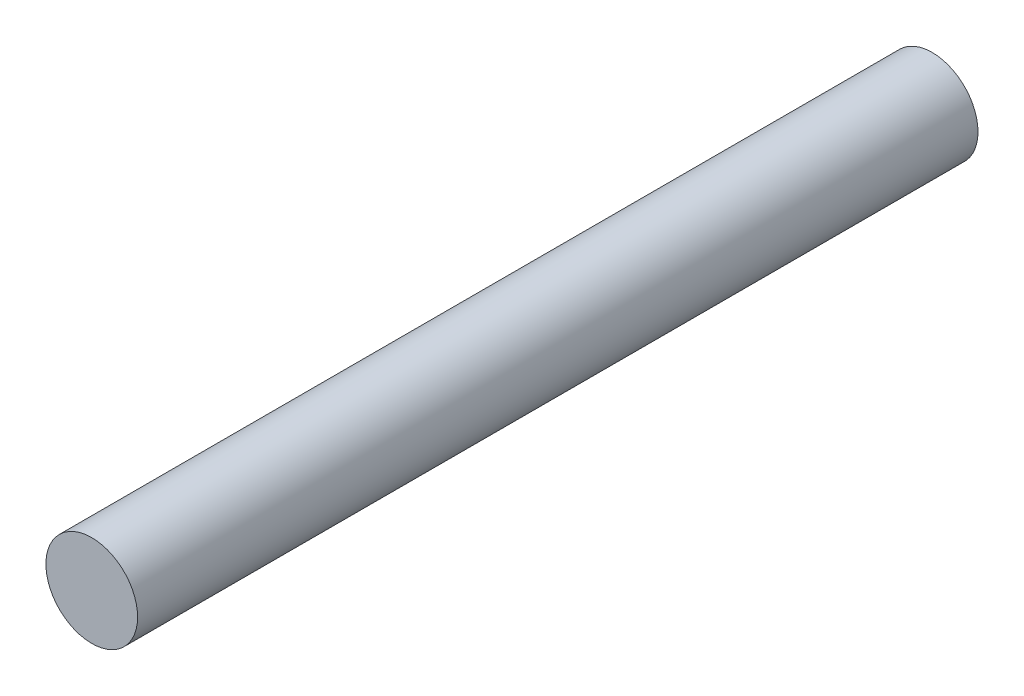
ISO-10303-21;
HEADER;
FILE_DESCRIPTION(('STEP AP214'),'2;1');
FILE_NAME('part.step','',(''),(''),'','','');
FILE_SCHEMA(('AUTOMOTIVE_DESIGN { 1 0 10303 214 1 1 1 1 }'));
ENDSEC;
DATA;
#1=APPLICATION_CONTEXT('core data for automotive mechanical design processes');
#2=APPLICATION_PROTOCOL_DEFINITION('international standard','automotive_design',2000,#1);
#3=PRODUCT_CONTEXT('',#1,'mechanical');
#4=PRODUCT('Part','Part','',(#3));
#5=PRODUCT_RELATED_PRODUCT_CATEGORY('part','',(#4));
#6=PRODUCT_DEFINITION_FORMATION('','',#4);
#7=PRODUCT_DEFINITION_CONTEXT('part definition',#1,'design');
#8=PRODUCT_DEFINITION('design','',#6,#7);
#9=PRODUCT_DEFINITION_SHAPE('','',#8);
#10=(LENGTH_UNIT() NAMED_UNIT(*) SI_UNIT(.MILLI.,.METRE.));
#11=(NAMED_UNIT(*) PLANE_ANGLE_UNIT() SI_UNIT($,.RADIAN.));
#12=(NAMED_UNIT(*) SI_UNIT($,.STERADIAN.) SOLID_ANGLE_UNIT());
#13=UNCERTAINTY_MEASURE_WITH_UNIT(LENGTH_MEASURE(1.E-05),#10,'distance_accuracy_value','');
#14=(GEOMETRIC_REPRESENTATION_CONTEXT(3) GLOBAL_UNCERTAINTY_ASSIGNED_CONTEXT((#13)) GLOBAL_UNIT_ASSIGNED_CONTEXT((#10,
#11,#12)) REPRESENTATION_CONTEXT('',''));
#15=CARTESIAN_POINT('',(0.,0.,0.));
#16=DIRECTION('',(0.,0.,1.));
#17=DIRECTION('',(1.,0.,0.));
#18=AXIS2_PLACEMENT_3D('',#15,#16,#17);
#19=CARTESIAN_POINT('',(0.,0.,55.));
#20=DIRECTION('',(0.,0.,-1.));
#21=DIRECTION('',(-1.,0.,0.));
#22=AXIS2_PLACEMENT_3D('',#19,#20,#21);
#23=CYLINDRICAL_SURFACE('',#22,3.);
#24=CARTESIAN_POINT('',(0.,0.,55.));
#25=DIRECTION('',(0.,0.,1.));
#26=DIRECTION('',(1.,0.,0.));
#27=AXIS2_PLACEMENT_3D('',#24,#25,#26);
#28=CIRCLE('',#27,3.);
#29=CARTESIAN_POINT('',(3.,0.,55.));
#30=VERTEX_POINT('',#29);
#31=EDGE_CURVE('E10',#30,#30,#28,.T.);
#32=ORIENTED_EDGE('',*,*,#31,.F.);
#33=EDGE_LOOP('',(#32));
#34=FACE_BOUND('',#33,.T.);
#35=CARTESIAN_POINT('',(0.,0.,0.));
#36=DIRECTION('',(0.,0.,1.));
#37=DIRECTION('',(1.,0.,0.));
#38=AXIS2_PLACEMENT_3D('',#35,#36,#37);
#39=CIRCLE('',#38,3.);
#40=CARTESIAN_POINT('',(3.,0.,0.));
#41=VERTEX_POINT('',#40);
#42=EDGE_CURVE('E36',#41,#41,#39,.T.);
#43=ORIENTED_EDGE('',*,*,#42,.T.);
#44=EDGE_LOOP('',(#43));
#45=FACE_BOUND('',#44,.T.);
#46=ADVANCED_FACE('F33',(#34,#45),#23,.T.);
#47=CARTESIAN_POINT('',(0.,0.,55.));
#48=DIRECTION('',(0.,0.,1.));
#49=DIRECTION('',(1.,0.,0.));
#50=AXIS2_PLACEMENT_3D('',#47,#48,#49);
#51=PLANE('',#50);
#52=ORIENTED_EDGE('',*,*,#31,.T.);
#53=EDGE_LOOP('',(#52));
#54=FACE_BOUND('',#53,.T.);
#55=ADVANCED_FACE('F48',(#54),#51,.T.);
#56=CARTESIAN_POINT('',(0.,0.,0.));
#57=DIRECTION('',(0.,0.,1.));
#58=DIRECTION('',(1.,0.,0.));
#59=AXIS2_PLACEMENT_3D('',#56,#57,#58);
#60=PLANE('',#59);
#61=ORIENTED_EDGE('',*,*,#42,.F.);
#62=EDGE_LOOP('',(#61));
#63=FACE_BOUND('',#62,.T.);
#64=ADVANCED_FACE('F46',(#63),#60,.F.);
#65=CLOSED_SHELL('',(#46,#55,#64));
#66=MANIFOLD_SOLID_BREP('B2',#65);
#67=ADVANCED_BREP_SHAPE_REPRESENTATION('',(#18,#66),#14);
#68=SHAPE_DEFINITION_REPRESENTATION(#9,#67);
ENDSEC;
END-ISO-10303-21;
